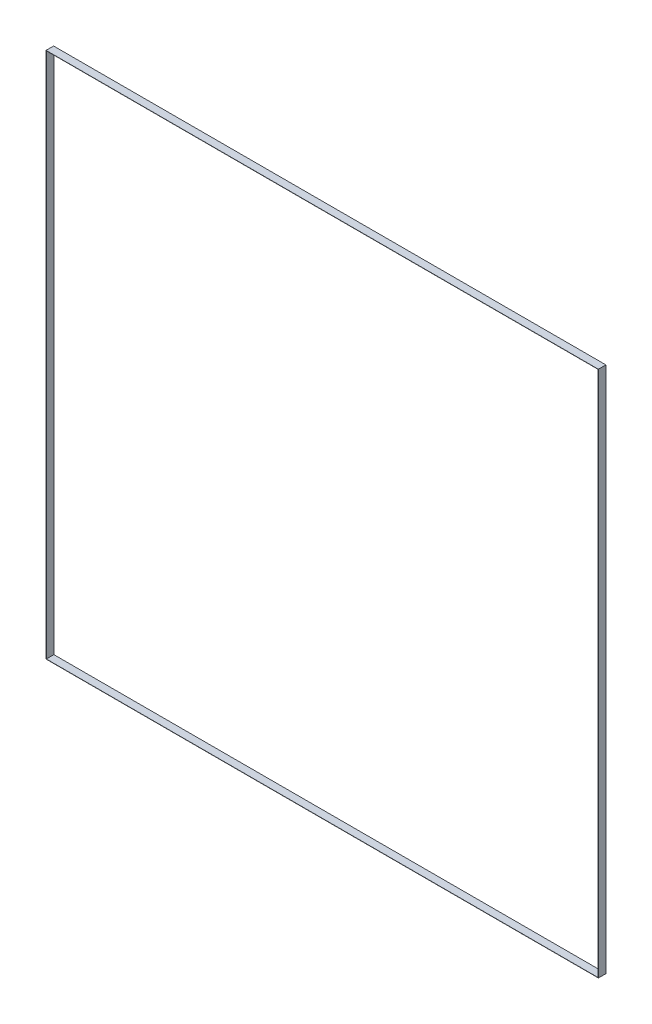
ISO-10303-21;
HEADER;
FILE_DESCRIPTION(('STEP AP214'),'2;1');
FILE_NAME('part.step','',(''),(''),'','','');
FILE_SCHEMA(('AUTOMOTIVE_DESIGN { 1 0 10303 214 1 1 1 1 }'));
ENDSEC;
DATA;
#1=APPLICATION_CONTEXT('core data for automotive mechanical design processes');
#2=APPLICATION_PROTOCOL_DEFINITION('international standard','automotive_design',2000,#1);
#3=PRODUCT_CONTEXT('',#1,'mechanical');
#4=PRODUCT('Part','Part','',(#3));
#5=PRODUCT_RELATED_PRODUCT_CATEGORY('part','',(#4));
#6=PRODUCT_DEFINITION_FORMATION('','',#4);
#7=PRODUCT_DEFINITION_CONTEXT('part definition',#1,'design');
#8=PRODUCT_DEFINITION('design','',#6,#7);
#9=PRODUCT_DEFINITION_SHAPE('','',#8);
#10=(LENGTH_UNIT() NAMED_UNIT(*) SI_UNIT(.MILLI.,.METRE.));
#11=(NAMED_UNIT(*) PLANE_ANGLE_UNIT() SI_UNIT($,.RADIAN.));
#12=(NAMED_UNIT(*) SI_UNIT($,.STERADIAN.) SOLID_ANGLE_UNIT());
#13=UNCERTAINTY_MEASURE_WITH_UNIT(LENGTH_MEASURE(1.E-05),#10,'distance_accuracy_value','');
#14=(GEOMETRIC_REPRESENTATION_CONTEXT(3) GLOBAL_UNCERTAINTY_ASSIGNED_CONTEXT((#13)) GLOBAL_UNIT_ASSIGNED_CONTEXT((#10,
#11,#12)) REPRESENTATION_CONTEXT('',''));
#15=CARTESIAN_POINT('',(0.,0.,0.));
#16=DIRECTION('',(0.,0.,1.));
#17=DIRECTION('',(1.,0.,0.));
#18=AXIS2_PLACEMENT_3D('',#15,#16,#17);
#19=CARTESIAN_POINT('',(0.,0.,0.15));
#20=DIRECTION('',(0.,0.,-1.));
#21=DIRECTION('',(-1.,0.,0.));
#22=AXIS2_PLACEMENT_3D('',#19,#20,#21);
#23=PLANE('',#22);
#24=DIRECTION('',(0.,1.,0.));
#25=VECTOR('',#24,1.);
#26=CARTESIAN_POINT('',(0.,0.,0.15));
#27=LINE('',#26,#25);
#28=CARTESIAN_POINT('',(0.,0.,0.15));
#29=VERTEX_POINT('',#28);
#30=CARTESIAN_POINT('',(0.,21.,0.15));
#31=VERTEX_POINT('',#30);
#32=EDGE_CURVE('E142',#29,#31,#27,.T.);
#33=ORIENTED_EDGE('',*,*,#32,.T.);
#34=DIRECTION('',(-1.,0.,0.));
#35=VECTOR('',#34,1.);
#36=CARTESIAN_POINT('',(-22.,21.,0.15));
#37=LINE('',#36,#35);
#38=CARTESIAN_POINT('',(-22.,21.,0.15));
#39=VERTEX_POINT('',#38);
#40=EDGE_CURVE('E145',#31,#39,#37,.T.);
#41=ORIENTED_EDGE('',*,*,#40,.T.);
#42=DIRECTION('',(0.,-1.,0.));
#43=VECTOR('',#42,1.);
#44=CARTESIAN_POINT('',(-22.,0.,0.15));
#45=LINE('',#44,#43);
#46=CARTESIAN_POINT('',(-22.,0.,0.15));
#47=VERTEX_POINT('',#46);
#48=EDGE_CURVE('E148',#39,#47,#45,.T.);
#49=ORIENTED_EDGE('',*,*,#48,.T.);
#50=DIRECTION('',(1.,0.,0.));
#51=VECTOR('',#50,1.);
#52=CARTESIAN_POINT('',(0.,0.,0.15));
#53=LINE('',#52,#51);
#54=EDGE_CURVE('E150',#47,#29,#53,.T.);
#55=ORIENTED_EDGE('',*,*,#54,.T.);
#56=EDGE_LOOP('',(#33,#41,#49,#55));
#57=FACE_BOUND('',#56,.T.);
#58=DIRECTION('',(0.,1.,0.));
#59=VECTOR('',#58,1.);
#60=CARTESIAN_POINT('',(-0.01,0.01,0.15));
#61=LINE('',#60,#59);
#62=CARTESIAN_POINT('',(-0.01,0.01,0.15));
#63=VERTEX_POINT('',#62);
#64=CARTESIAN_POINT('',(-0.01,20.99,0.15));
#65=VERTEX_POINT('',#64);
#66=EDGE_CURVE('E100',#63,#65,#61,.T.);
#67=ORIENTED_EDGE('',*,*,#66,.F.);
#68=DIRECTION('',(1.,0.,0.));
#69=VECTOR('',#68,1.);
#70=CARTESIAN_POINT('',(-0.01,0.01,0.15));
#71=LINE('',#70,#69);
#72=CARTESIAN_POINT('',(-21.99,0.00999999999999731,0.15));
#73=VERTEX_POINT('',#72);
#74=EDGE_CURVE('E125',#73,#63,#71,.T.);
#75=ORIENTED_EDGE('',*,*,#74,.F.);
#76=DIRECTION('',(0.,-1.,0.));
#77=VECTOR('',#76,1.);
#78=CARTESIAN_POINT('',(-21.99,0.00999999999999731,0.15));
#79=LINE('',#78,#77);
#80=CARTESIAN_POINT('',(-21.99,20.99,0.15));
#81=VERTEX_POINT('',#80);
#82=EDGE_CURVE('E120',#81,#73,#79,.T.);
#83=ORIENTED_EDGE('',*,*,#82,.F.);
#84=DIRECTION('',(-1.,0.,0.));
#85=VECTOR('',#84,1.);
#86=CARTESIAN_POINT('',(-0.01,20.99,0.15));
#87=LINE('',#86,#85);
#88=EDGE_CURVE('E108',#65,#81,#87,.T.);
#89=ORIENTED_EDGE('',*,*,#88,.F.);
#90=EDGE_LOOP('',(#67,#75,#83,#89));
#91=FACE_BOUND('',#90,.T.);
#92=ADVANCED_FACE('F35',(#57,#91),#23,.F.);
#93=CARTESIAN_POINT('',(0.,0.,-0.15));
#94=DIRECTION('',(0.,0.,-1.));
#95=DIRECTION('',(-1.,0.,0.));
#96=AXIS2_PLACEMENT_3D('',#93,#94,#95);
#97=PLANE('',#96);
#98=DIRECTION('',(0.,1.,0.));
#99=VECTOR('',#98,1.);
#100=CARTESIAN_POINT('',(0.,0.,-0.15));
#101=LINE('',#100,#99);
#102=CARTESIAN_POINT('',(0.,0.,-0.15));
#103=VERTEX_POINT('',#102);
#104=CARTESIAN_POINT('',(0.,21.,-0.15));
#105=VERTEX_POINT('',#104);
#106=EDGE_CURVE('E116',#103,#105,#101,.T.);
#107=ORIENTED_EDGE('',*,*,#106,.F.);
#108=DIRECTION('',(1.,0.,0.));
#109=VECTOR('',#108,1.);
#110=CARTESIAN_POINT('',(0.,0.,-0.15));
#111=LINE('',#110,#109);
#112=CARTESIAN_POINT('',(-22.,0.,-0.15));
#113=VERTEX_POINT('',#112);
#114=EDGE_CURVE('E146',#113,#103,#111,.T.);
#115=ORIENTED_EDGE('',*,*,#114,.F.);
#116=DIRECTION('',(0.,-1.,0.));
#117=VECTOR('',#116,1.);
#118=CARTESIAN_POINT('',(-22.,0.,-0.15));
#119=LINE('',#118,#117);
#120=CARTESIAN_POINT('',(-22.,21.,-0.15));
#121=VERTEX_POINT('',#120);
#122=EDGE_CURVE('E157',#121,#113,#119,.T.);
#123=ORIENTED_EDGE('',*,*,#122,.F.);
#124=DIRECTION('',(-1.,0.,0.));
#125=VECTOR('',#124,1.);
#126=CARTESIAN_POINT('',(-22.,21.,-0.15));
#127=LINE('',#126,#125);
#128=EDGE_CURVE('E155',#105,#121,#127,.T.);
#129=ORIENTED_EDGE('',*,*,#128,.F.);
#130=EDGE_LOOP('',(#107,#115,#123,#129));
#131=FACE_BOUND('',#130,.T.);
#132=DIRECTION('',(1.,0.,0.));
#133=VECTOR('',#132,1.);
#134=CARTESIAN_POINT('',(-0.01,0.01,-0.15));
#135=LINE('',#134,#133);
#136=CARTESIAN_POINT('',(-21.99,0.00999999999999731,-0.15));
#137=VERTEX_POINT('',#136);
#138=CARTESIAN_POINT('',(-0.01,0.01,-0.15));
#139=VERTEX_POINT('',#138);
#140=EDGE_CURVE('E109',#137,#139,#135,.T.);
#141=ORIENTED_EDGE('',*,*,#140,.T.);
#142=DIRECTION('',(0.,1.,0.));
#143=VECTOR('',#142,1.);
#144=CARTESIAN_POINT('',(-0.01,0.01,-0.15));
#145=LINE('',#144,#143);
#146=CARTESIAN_POINT('',(-0.01,20.99,-0.15));
#147=VERTEX_POINT('',#146);
#148=EDGE_CURVE('E58',#139,#147,#145,.T.);
#149=ORIENTED_EDGE('',*,*,#148,.T.);
#150=DIRECTION('',(-1.,0.,0.));
#151=VECTOR('',#150,1.);
#152=CARTESIAN_POINT('',(-0.01,20.99,-0.15));
#153=LINE('',#152,#151);
#154=CARTESIAN_POINT('',(-21.99,20.99,-0.15));
#155=VERTEX_POINT('',#154);
#156=EDGE_CURVE('E115',#147,#155,#153,.T.);
#157=ORIENTED_EDGE('',*,*,#156,.T.);
#158=DIRECTION('',(0.,-1.,0.));
#159=VECTOR('',#158,1.);
#160=CARTESIAN_POINT('',(-21.99,0.00999999999999731,-0.15));
#161=LINE('',#160,#159);
#162=EDGE_CURVE('E133',#155,#137,#161,.T.);
#163=ORIENTED_EDGE('',*,*,#162,.T.);
#164=EDGE_LOOP('',(#141,#149,#157,#163));
#165=FACE_BOUND('',#164,.T.);
#166=ADVANCED_FACE('F176',(#131,#165),#97,.T.);
#167=CARTESIAN_POINT('',(0.,0.,0.15));
#168=DIRECTION('',(-1.,0.,0.));
#169=DIRECTION('',(0.,0.,1.));
#170=AXIS2_PLACEMENT_3D('',#167,#168,#169);
#171=PLANE('',#170);
#172=ORIENTED_EDGE('',*,*,#106,.T.);
#173=DIRECTION('',(0.,0.,-1.));
#174=VECTOR('',#173,1.);
#175=CARTESIAN_POINT('',(0.,21.,0.15));
#176=LINE('',#175,#174);
#177=EDGE_CURVE('E11',#31,#105,#176,.T.);
#178=ORIENTED_EDGE('',*,*,#177,.F.);
#179=ORIENTED_EDGE('',*,*,#32,.F.);
#180=DIRECTION('',(0.,0.,-1.));
#181=VECTOR('',#180,1.);
#182=CARTESIAN_POINT('',(0.,0.,0.15));
#183=LINE('',#182,#181);
#184=EDGE_CURVE('E152',#29,#103,#183,.T.);
#185=ORIENTED_EDGE('',*,*,#184,.T.);
#186=EDGE_LOOP('',(#172,#178,#179,#185));
#187=FACE_BOUND('',#186,.T.);
#188=ADVANCED_FACE('F37',(#187),#171,.F.);
#189=CARTESIAN_POINT('',(-22.,21.,0.15));
#190=DIRECTION('',(0.,-1.,0.));
#191=DIRECTION('',(0.,0.,-1.));
#192=AXIS2_PLACEMENT_3D('',#189,#190,#191);
#193=PLANE('',#192);
#194=ORIENTED_EDGE('',*,*,#128,.T.);
#195=DIRECTION('',(0.,0.,-1.));
#196=VECTOR('',#195,1.);
#197=CARTESIAN_POINT('',(-22.,21.,0.15));
#198=LINE('',#197,#196);
#199=EDGE_CURVE('E43',#39,#121,#198,.T.);
#200=ORIENTED_EDGE('',*,*,#199,.F.);
#201=ORIENTED_EDGE('',*,*,#40,.F.);
#202=ORIENTED_EDGE('',*,*,#177,.T.);
#203=EDGE_LOOP('',(#194,#200,#201,#202));
#204=FACE_BOUND('',#203,.T.);
#205=ADVANCED_FACE('F186',(#204),#193,.F.);
#206=CARTESIAN_POINT('',(-22.,0.,0.15));
#207=DIRECTION('',(1.,0.,0.));
#208=DIRECTION('',(0.,0.,-1.));
#209=AXIS2_PLACEMENT_3D('',#206,#207,#208);
#210=PLANE('',#209);
#211=ORIENTED_EDGE('',*,*,#122,.T.);
#212=DIRECTION('',(0.,0.,-1.));
#213=VECTOR('',#212,1.);
#214=CARTESIAN_POINT('',(-22.,0.,0.15));
#215=LINE('',#214,#213);
#216=EDGE_CURVE('E163',#47,#113,#215,.T.);
#217=ORIENTED_EDGE('',*,*,#216,.F.);
#218=ORIENTED_EDGE('',*,*,#48,.F.);
#219=ORIENTED_EDGE('',*,*,#199,.T.);
#220=EDGE_LOOP('',(#211,#217,#218,#219));
#221=FACE_BOUND('',#220,.T.);
#222=ADVANCED_FACE('F170',(#221),#210,.F.);
#223=CARTESIAN_POINT('',(0.,0.,0.15));
#224=DIRECTION('',(0.,1.,0.));
#225=DIRECTION('',(-1.,0.,0.));
#226=AXIS2_PLACEMENT_3D('',#223,#224,#225);
#227=PLANE('',#226);
#228=ORIENTED_EDGE('',*,*,#114,.T.);
#229=ORIENTED_EDGE('',*,*,#184,.F.);
#230=ORIENTED_EDGE('',*,*,#54,.F.);
#231=ORIENTED_EDGE('',*,*,#216,.T.);
#232=EDGE_LOOP('',(#228,#229,#230,#231));
#233=FACE_BOUND('',#232,.T.);
#234=ADVANCED_FACE('F180',(#233),#227,.F.);
#235=CARTESIAN_POINT('',(-0.01,0.01,0.15));
#236=DIRECTION('',(-1.,0.,0.));
#237=DIRECTION('',(0.,0.,1.));
#238=AXIS2_PLACEMENT_3D('',#235,#236,#237);
#239=PLANE('',#238);
#240=ORIENTED_EDGE('',*,*,#148,.F.);
#241=DIRECTION('',(0.,0.,-1.));
#242=VECTOR('',#241,1.);
#243=CARTESIAN_POINT('',(-0.01,0.01,0.15));
#244=LINE('',#243,#242);
#245=EDGE_CURVE('E104',#63,#139,#244,.T.);
#246=ORIENTED_EDGE('',*,*,#245,.F.);
#247=ORIENTED_EDGE('',*,*,#66,.T.);
#248=DIRECTION('',(0.,0.,-1.));
#249=VECTOR('',#248,1.);
#250=CARTESIAN_POINT('',(-0.01,20.99,0.15));
#251=LINE('',#250,#249);
#252=EDGE_CURVE('E103',#65,#147,#251,.T.);
#253=ORIENTED_EDGE('',*,*,#252,.T.);
#254=EDGE_LOOP('',(#240,#246,#247,#253));
#255=FACE_BOUND('',#254,.T.);
#256=ADVANCED_FACE('F102',(#255),#239,.T.);
#257=CARTESIAN_POINT('',(-0.01,20.99,0.15));
#258=DIRECTION('',(0.,-1.,0.));
#259=DIRECTION('',(1.,0.,0.));
#260=AXIS2_PLACEMENT_3D('',#257,#258,#259);
#261=PLANE('',#260);
#262=ORIENTED_EDGE('',*,*,#156,.F.);
#263=ORIENTED_EDGE('',*,*,#252,.F.);
#264=ORIENTED_EDGE('',*,*,#88,.T.);
#265=DIRECTION('',(0.,0.,-1.));
#266=VECTOR('',#265,1.);
#267=CARTESIAN_POINT('',(-21.99,20.99,0.15));
#268=LINE('',#267,#266);
#269=EDGE_CURVE('E117',#81,#155,#268,.T.);
#270=ORIENTED_EDGE('',*,*,#269,.T.);
#271=EDGE_LOOP('',(#262,#263,#264,#270));
#272=FACE_BOUND('',#271,.T.);
#273=ADVANCED_FACE('F112',(#272),#261,.T.);
#274=CARTESIAN_POINT('',(-21.99,0.00999999999999731,0.15));
#275=DIRECTION('',(1.,0.,0.));
#276=DIRECTION('',(0.,0.,-1.));
#277=AXIS2_PLACEMENT_3D('',#274,#275,#276);
#278=PLANE('',#277);
#279=ORIENTED_EDGE('',*,*,#162,.F.);
#280=ORIENTED_EDGE('',*,*,#269,.F.);
#281=ORIENTED_EDGE('',*,*,#82,.T.);
#282=DIRECTION('',(0.,0.,-1.));
#283=VECTOR('',#282,1.);
#284=CARTESIAN_POINT('',(-21.99,0.00999999999999731,0.15));
#285=LINE('',#284,#283);
#286=EDGE_CURVE('E50',#73,#137,#285,.T.);
#287=ORIENTED_EDGE('',*,*,#286,.T.);
#288=EDGE_LOOP('',(#279,#280,#281,#287));
#289=FACE_BOUND('',#288,.T.);
#290=ADVANCED_FACE('F209',(#289),#278,.T.);
#291=CARTESIAN_POINT('',(-0.01,0.01,0.15));
#292=DIRECTION('',(0.,1.,0.));
#293=DIRECTION('',(-1.,0.,0.));
#294=AXIS2_PLACEMENT_3D('',#291,#292,#293);
#295=PLANE('',#294);
#296=ORIENTED_EDGE('',*,*,#140,.F.);
#297=ORIENTED_EDGE('',*,*,#286,.F.);
#298=ORIENTED_EDGE('',*,*,#74,.T.);
#299=ORIENTED_EDGE('',*,*,#245,.T.);
#300=EDGE_LOOP('',(#296,#297,#298,#299));
#301=FACE_BOUND('',#300,.T.);
#302=ADVANCED_FACE('F213',(#301),#295,.T.);
#303=CLOSED_SHELL('',(#92,#166,#188,#205,#222,#234,#256,#273,#290,#302));
#304=MANIFOLD_SOLID_BREP('B2',#303);
#305=ADVANCED_BREP_SHAPE_REPRESENTATION('',(#18,#304),#14);
#306=SHAPE_DEFINITION_REPRESENTATION(#9,#305);
ENDSEC;
END-ISO-10303-21;
